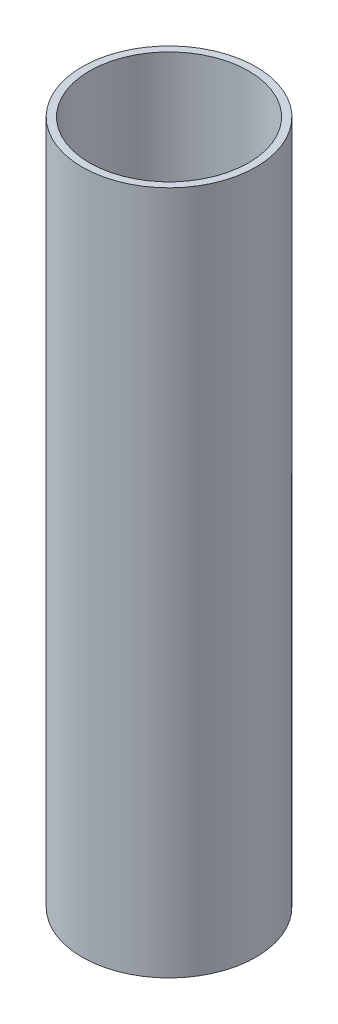
ISO-10303-21;
HEADER;
FILE_DESCRIPTION(('STEP AP214'),'2;1');
FILE_NAME('part.step','',(''),(''),'','','');
FILE_SCHEMA(('AUTOMOTIVE_DESIGN { 1 0 10303 214 1 1 1 1 }'));
ENDSEC;
DATA;
#1=APPLICATION_CONTEXT('core data for automotive mechanical design processes');
#2=APPLICATION_PROTOCOL_DEFINITION('international standard','automotive_design',2000,#1);
#3=PRODUCT_CONTEXT('',#1,'mechanical');
#4=PRODUCT('Part','Part','',(#3));
#5=PRODUCT_RELATED_PRODUCT_CATEGORY('part','',(#4));
#6=PRODUCT_DEFINITION_FORMATION('','',#4);
#7=PRODUCT_DEFINITION_CONTEXT('part definition',#1,'design');
#8=PRODUCT_DEFINITION('design','',#6,#7);
#9=PRODUCT_DEFINITION_SHAPE('','',#8);
#10=(LENGTH_UNIT() NAMED_UNIT(*) SI_UNIT(.MILLI.,.METRE.));
#11=(NAMED_UNIT(*) PLANE_ANGLE_UNIT() SI_UNIT($,.RADIAN.));
#12=(NAMED_UNIT(*) SI_UNIT($,.STERADIAN.) SOLID_ANGLE_UNIT());
#13=UNCERTAINTY_MEASURE_WITH_UNIT(LENGTH_MEASURE(1.E-05),#10,'distance_accuracy_value','');
#14=(GEOMETRIC_REPRESENTATION_CONTEXT(3) GLOBAL_UNCERTAINTY_ASSIGNED_CONTEXT((#13)) GLOBAL_UNIT_ASSIGNED_CONTEXT((#10,
#11,#12)) REPRESENTATION_CONTEXT('',''));
#15=CARTESIAN_POINT('',(0.,0.,0.));
#16=DIRECTION('',(0.,0.,1.));
#17=DIRECTION('',(1.,0.,0.));
#18=AXIS2_PLACEMENT_3D('',#15,#16,#17);
#19=CARTESIAN_POINT('',(0.,150.,0.));
#20=DIRECTION('',(0.,1.,0.));
#21=DIRECTION('',(0.,0.,1.));
#22=AXIS2_PLACEMENT_3D('',#19,#20,#21);
#23=PLANE('',#22);
#24=CARTESIAN_POINT('',(0.,150.,0.));
#25=DIRECTION('',(0.,1.,0.));
#26=DIRECTION('',(0.,0.,1.));
#27=AXIS2_PLACEMENT_3D('',#24,#25,#26);
#28=CIRCLE('',#27,19.05);
#29=CARTESIAN_POINT('',(0.,150.,19.05));
#30=VERTEX_POINT('',#29);
#31=EDGE_CURVE('E10',#30,#30,#28,.T.);
#32=ORIENTED_EDGE('',*,*,#31,.T.);
#33=EDGE_LOOP('',(#32));
#34=FACE_BOUND('',#33,.T.);
#35=CARTESIAN_POINT('',(0.,150.,0.));
#36=DIRECTION('',(0.,1.,0.));
#37=DIRECTION('',(0.,0.,1.));
#38=AXIS2_PLACEMENT_3D('',#35,#36,#37);
#39=CIRCLE('',#38,17.45);
#40=CARTESIAN_POINT('',(0.,150.,17.45));
#41=VERTEX_POINT('',#40);
#42=EDGE_CURVE('E42',#41,#41,#39,.T.);
#43=ORIENTED_EDGE('',*,*,#42,.F.);
#44=EDGE_LOOP('',(#43));
#45=FACE_BOUND('',#44,.T.);
#46=ADVANCED_FACE('F31',(#34,#45),#23,.T.);
#47=CARTESIAN_POINT('',(0.,0.,0.));
#48=DIRECTION('',(0.,1.,0.));
#49=DIRECTION('',(0.,0.,1.));
#50=AXIS2_PLACEMENT_3D('',#47,#48,#49);
#51=PLANE('',#50);
#52=CARTESIAN_POINT('',(0.,0.,0.));
#53=DIRECTION('',(0.,1.,0.));
#54=DIRECTION('',(0.,0.,1.));
#55=AXIS2_PLACEMENT_3D('',#52,#53,#54);
#56=CIRCLE('',#55,19.05);
#57=CARTESIAN_POINT('',(0.,0.,19.05));
#58=VERTEX_POINT('',#57);
#59=EDGE_CURVE('E35',#58,#58,#56,.T.);
#60=ORIENTED_EDGE('',*,*,#59,.F.);
#61=EDGE_LOOP('',(#60));
#62=FACE_BOUND('',#61,.T.);
#63=CARTESIAN_POINT('',(0.,0.,0.));
#64=DIRECTION('',(0.,1.,0.));
#65=DIRECTION('',(0.,0.,1.));
#66=AXIS2_PLACEMENT_3D('',#63,#64,#65);
#67=CIRCLE('',#66,17.45);
#68=CARTESIAN_POINT('',(0.,0.,17.45));
#69=VERTEX_POINT('',#68);
#70=EDGE_CURVE('E44',#69,#69,#67,.T.);
#71=ORIENTED_EDGE('',*,*,#70,.T.);
#72=EDGE_LOOP('',(#71));
#73=FACE_BOUND('',#72,.T.);
#74=ADVANCED_FACE('F54',(#62,#73),#51,.F.);
#75=CARTESIAN_POINT('',(0.,150.,0.));
#76=DIRECTION('',(0.,-1.,0.));
#77=DIRECTION('',(0.,0.,-1.));
#78=AXIS2_PLACEMENT_3D('',#75,#76,#77);
#79=CYLINDRICAL_SURFACE('',#78,19.05);
#80=ORIENTED_EDGE('',*,*,#31,.F.);
#81=EDGE_LOOP('',(#80));
#82=FACE_BOUND('',#81,.T.);
#83=ORIENTED_EDGE('',*,*,#59,.T.);
#84=EDGE_LOOP('',(#83));
#85=FACE_BOUND('',#84,.T.);
#86=ADVANCED_FACE('F33',(#82,#85),#79,.T.);
#87=CARTESIAN_POINT('',(0.,150.,0.));
#88=DIRECTION('',(0.,-1.,0.));
#89=DIRECTION('',(0.,0.,-1.));
#90=AXIS2_PLACEMENT_3D('',#87,#88,#89);
#91=CYLINDRICAL_SURFACE('',#90,17.45);
#92=ORIENTED_EDGE('',*,*,#42,.T.);
#93=EDGE_LOOP('',(#92));
#94=FACE_BOUND('',#93,.T.);
#95=ORIENTED_EDGE('',*,*,#70,.F.);
#96=EDGE_LOOP('',(#95));
#97=FACE_BOUND('',#96,.T.);
#98=ADVANCED_FACE('F50',(#94,#97),#91,.F.);
#99=CLOSED_SHELL('',(#46,#74,#86,#98));
#100=MANIFOLD_SOLID_BREP('B2',#99);
#101=ADVANCED_BREP_SHAPE_REPRESENTATION('',(#18,#100),#14);
#102=SHAPE_DEFINITION_REPRESENTATION(#9,#101);
ENDSEC;
END-ISO-10303-21;
